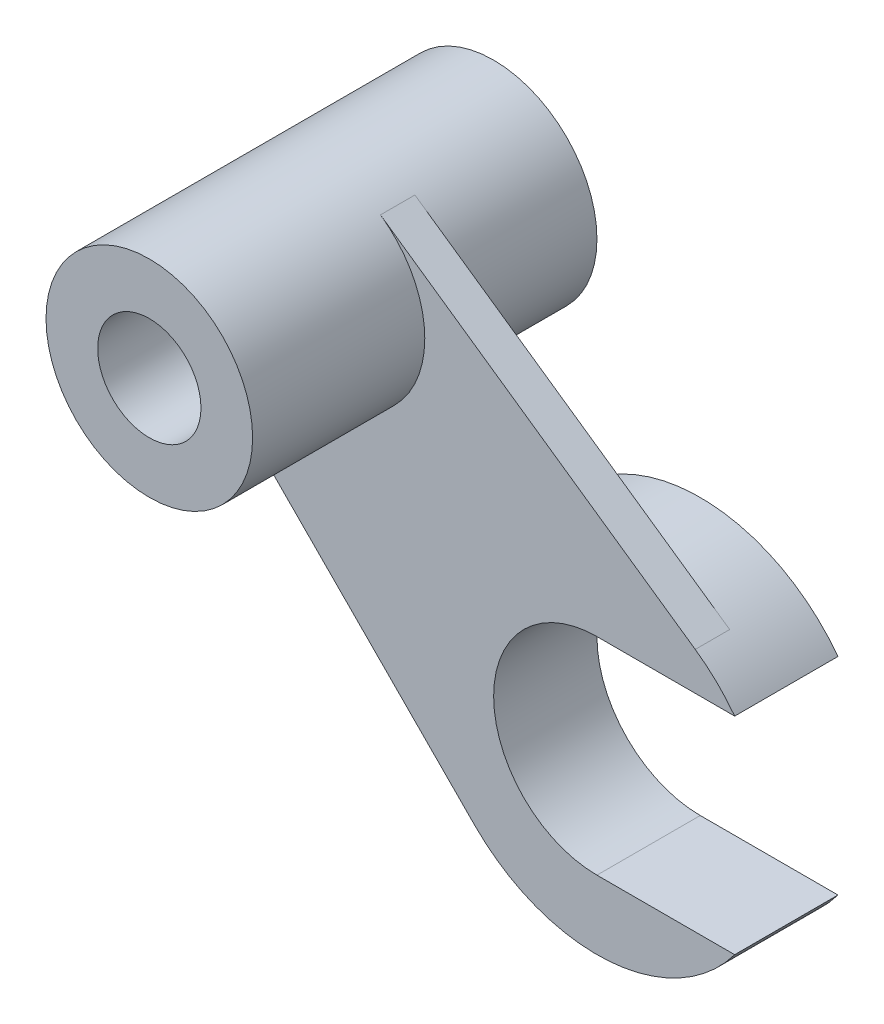
ISO-10303-21;
HEADER;
FILE_DESCRIPTION(('STEP AP214'),'2;1');
FILE_NAME('part.step','',(''),(''),'','','');
FILE_SCHEMA(('AUTOMOTIVE_DESIGN { 1 0 10303 214 1 1 1 1 }'));
ENDSEC;
DATA;
#1=APPLICATION_CONTEXT('core data for automotive mechanical design processes');
#2=APPLICATION_PROTOCOL_DEFINITION('international standard','automotive_design',2000,#1);
#3=PRODUCT_CONTEXT('',#1,'mechanical');
#4=PRODUCT('Part','Part','',(#3));
#5=PRODUCT_RELATED_PRODUCT_CATEGORY('part','',(#4));
#6=PRODUCT_DEFINITION_FORMATION('','',#4);
#7=PRODUCT_DEFINITION_CONTEXT('part definition',#1,'design');
#8=PRODUCT_DEFINITION('design','',#6,#7);
#9=PRODUCT_DEFINITION_SHAPE('','',#8);
#10=(LENGTH_UNIT() NAMED_UNIT(*) SI_UNIT(.MILLI.,.METRE.));
#11=(NAMED_UNIT(*) PLANE_ANGLE_UNIT() SI_UNIT($,.RADIAN.));
#12=(NAMED_UNIT(*) SI_UNIT($,.STERADIAN.) SOLID_ANGLE_UNIT());
#13=UNCERTAINTY_MEASURE_WITH_UNIT(LENGTH_MEASURE(1.E-05),#10,'distance_accuracy_value','');
#14=(GEOMETRIC_REPRESENTATION_CONTEXT(3) GLOBAL_UNCERTAINTY_ASSIGNED_CONTEXT((#13)) GLOBAL_UNIT_ASSIGNED_CONTEXT((#10,
#11,#12)) REPRESENTATION_CONTEXT('',''));
#15=CARTESIAN_POINT('',(0.,0.,0.));
#16=DIRECTION('',(0.,0.,1.));
#17=DIRECTION('',(1.,0.,0.));
#18=AXIS2_PLACEMENT_3D('',#15,#16,#17);
#19=CARTESIAN_POINT('',(0.,0.,50.));
#20=DIRECTION('',(0.,0.,-1.));
#21=DIRECTION('',(-1.,0.,0.));
#22=AXIS2_PLACEMENT_3D('',#19,#20,#21);
#23=CYLINDRICAL_SURFACE('',#22,30.);
#24=CARTESIAN_POINT('',(0.,0.,-50.));
#25=DIRECTION('',(0.,0.,1.));
#26=DIRECTION('',(1.,0.,0.));
#27=AXIS2_PLACEMENT_3D('',#24,#25,#26);
#28=CIRCLE('',#27,30.);
#29=CARTESIAN_POINT('',(30.,0.,-50.));
#30=VERTEX_POINT('',#29);
#31=EDGE_CURVE('E186',#30,#30,#28,.T.);
#32=ORIENTED_EDGE('',*,*,#31,.T.);
#33=EDGE_LOOP('',(#32));
#34=FACE_BOUND('',#33,.T.);
#35=CARTESIAN_POINT('',(0.,0.,50.));
#36=DIRECTION('',(0.,0.,1.));
#37=DIRECTION('',(1.,0.,0.));
#38=AXIS2_PLACEMENT_3D('',#35,#36,#37);
#39=CIRCLE('',#38,30.);
#40=CARTESIAN_POINT('',(30.,0.,50.));
#41=VERTEX_POINT('',#40);
#42=EDGE_CURVE('E205',#41,#41,#39,.T.);
#43=ORIENTED_EDGE('',*,*,#42,.F.);
#44=EDGE_LOOP('',(#43));
#45=FACE_BOUND('',#44,.T.);
#46=CARTESIAN_POINT('',(0.,0.,-9.99999999999999));
#47=DIRECTION('',(0.,0.,1.));
#48=DIRECTION('',(1.,0.,0.));
#49=AXIS2_PLACEMENT_3D('',#46,#47,#48);
#50=CIRCLE('',#49,30.);
#51=CARTESIAN_POINT('',(-30.,0.,-10.));
#52=VERTEX_POINT('',#51);
#53=CARTESIAN_POINT('',(17.1291163606126,24.6291163606126,-10.));
#54=VERTEX_POINT('',#53);
#55=EDGE_CURVE('E121',#52,#54,#50,.T.);
#56=ORIENTED_EDGE('',*,*,#55,.F.);
#57=DIRECTION('',(0.,0.,1.));
#58=VECTOR('',#57,1.);
#59=CARTESIAN_POINT('',(-30.,0.,-10.));
#60=LINE('',#59,#58);
#61=CARTESIAN_POINT('',(-30.,0.,0.));
#62=VERTEX_POINT('',#61);
#63=EDGE_CURVE('E187',#52,#62,#60,.T.);
#64=ORIENTED_EDGE('',*,*,#63,.T.);
#65=CARTESIAN_POINT('',(0.,0.,0.));
#66=DIRECTION('',(0.,0.,1.));
#67=DIRECTION('',(1.,0.,0.));
#68=AXIS2_PLACEMENT_3D('',#65,#66,#67);
#69=CIRCLE('',#68,30.);
#70=CARTESIAN_POINT('',(17.1291163606126,24.6291163606126,0.));
#71=VERTEX_POINT('',#70);
#72=EDGE_CURVE('E209',#62,#71,#69,.T.);
#73=ORIENTED_EDGE('',*,*,#72,.T.);
#74=DIRECTION('',(0.,0.,1.));
#75=VECTOR('',#74,1.);
#76=CARTESIAN_POINT('',(17.1291163606126,24.6291163606126,-10.));
#77=LINE('',#76,#75);
#78=EDGE_CURVE('E191',#54,#71,#77,.T.);
#79=ORIENTED_EDGE('',*,*,#78,.F.);
#80=EDGE_LOOP('',(#56,#64,#73,#79));
#81=FACE_BOUND('',#80,.T.);
#82=ADVANCED_FACE('F45',(#34,#45,#81),#23,.T.);
#83=CARTESIAN_POINT('',(0.,0.,50.));
#84=DIRECTION('',(0.,0.,1.));
#85=DIRECTION('',(1.,0.,0.));
#86=AXIS2_PLACEMENT_3D('',#83,#84,#85);
#87=PLANE('',#86);
#88=CARTESIAN_POINT('',(0.,0.,50.));
#89=DIRECTION('',(0.,0.,1.));
#90=DIRECTION('',(1.,0.,0.));
#91=AXIS2_PLACEMENT_3D('',#88,#89,#90);
#92=CIRCLE('',#91,15.);
#93=CARTESIAN_POINT('',(15.,0.,50.));
#94=VERTEX_POINT('',#93);
#95=EDGE_CURVE('E133',#94,#94,#92,.T.);
#96=ORIENTED_EDGE('',*,*,#95,.F.);
#97=EDGE_LOOP('',(#96));
#98=FACE_BOUND('',#97,.T.);
#99=ORIENTED_EDGE('',*,*,#42,.T.);
#100=EDGE_LOOP('',(#99));
#101=FACE_BOUND('',#100,.T.);
#102=ADVANCED_FACE('F259',(#98,#101),#87,.T.);
#103=CARTESIAN_POINT('',(0.,0.,-50.));
#104=DIRECTION('',(0.,0.,1.));
#105=DIRECTION('',(1.,0.,0.));
#106=AXIS2_PLACEMENT_3D('',#103,#104,#105);
#107=PLANE('',#106);
#108=CARTESIAN_POINT('',(0.,0.,-50.));
#109=DIRECTION('',(0.,0.,1.));
#110=DIRECTION('',(1.,0.,0.));
#111=AXIS2_PLACEMENT_3D('',#108,#109,#110);
#112=CIRCLE('',#111,15.);
#113=CARTESIAN_POINT('',(15.,0.,-50.));
#114=VERTEX_POINT('',#113);
#115=EDGE_CURVE('E139',#114,#114,#112,.T.);
#116=ORIENTED_EDGE('',*,*,#115,.T.);
#117=EDGE_LOOP('',(#116));
#118=FACE_BOUND('',#117,.T.);
#119=ORIENTED_EDGE('',*,*,#31,.F.);
#120=EDGE_LOOP('',(#119));
#121=FACE_BOUND('',#120,.T.);
#122=ADVANCED_FACE('F265',(#118,#121),#107,.F.);
#123=CARTESIAN_POINT('',(-30.,-40.,-10.));
#124=DIRECTION('',(-0.710452707861558,-0.703744946619284,0.));
#125=DIRECTION('',(0.703744946619284,-0.710452707861558,0.));
#126=AXIS2_PLACEMENT_3D('',#123,#124,#125);
#127=PLANE('',#126);
#128=DIRECTION('',(0.703744946619284,-0.710452707861558,0.));
#129=VECTOR('',#128,1.);
#130=CARTESIAN_POINT('',(-30.,-40.,0.));
#131=LINE('',#130,#129);
#132=CARTESIAN_POINT('',(-30.,-40.,0.));
#133=VERTEX_POINT('',#132);
#134=CARTESIAN_POINT('',(44.4773646069221,-115.187247330964,0.));
#135=VERTEX_POINT('',#134);
#136=EDGE_CURVE('E159',#133,#135,#131,.T.);
#137=ORIENTED_EDGE('',*,*,#136,.F.);
#138=DIRECTION('',(0.,0.,1.));
#139=VECTOR('',#138,1.);
#140=CARTESIAN_POINT('',(-30.,-40.,-10.));
#141=LINE('',#140,#139);
#142=CARTESIAN_POINT('',(-30.,-40.,-10.));
#143=VERTEX_POINT('',#142);
#144=EDGE_CURVE('E183',#143,#133,#141,.T.);
#145=ORIENTED_EDGE('',*,*,#144,.F.);
#146=DIRECTION('',(0.703744946619284,-0.710452707861558,0.));
#147=VECTOR('',#146,1.);
#148=CARTESIAN_POINT('',(-30.,-40.,-10.));
#149=LINE('',#148,#147);
#150=CARTESIAN_POINT('',(44.4773646069221,-115.187247330964,-10.));
#151=VERTEX_POINT('',#150);
#152=EDGE_CURVE('E160',#143,#151,#149,.T.);
#153=ORIENTED_EDGE('',*,*,#152,.T.);
#154=DIRECTION('',(0.,0.,1.));
#155=VECTOR('',#154,1.);
#156=CARTESIAN_POINT('',(44.4773646069221,-115.187247330964,-10.));
#157=LINE('',#156,#155);
#158=EDGE_CURVE('E172',#151,#135,#157,.T.);
#159=ORIENTED_EDGE('',*,*,#158,.T.);
#160=EDGE_LOOP('',(#137,#145,#153,#159));
#161=FACE_BOUND('',#160,.T.);
#162=ADVANCED_FACE('F234',(#161),#127,.T.);
#163=CARTESIAN_POINT('',(-30.,-40.,-10.));
#164=DIRECTION('',(1.,0.,0.));
#165=DIRECTION('',(0.,0.,-1.));
#166=AXIS2_PLACEMENT_3D('',#163,#164,#165);
#167=PLANE('',#166);
#168=DIRECTION('',(0.,1.,0.));
#169=VECTOR('',#168,1.);
#170=CARTESIAN_POINT('',(-30.,-40.,0.));
#171=LINE('',#170,#169);
#172=EDGE_CURVE('E165',#133,#62,#171,.T.);
#173=ORIENTED_EDGE('',*,*,#172,.T.);
#174=ORIENTED_EDGE('',*,*,#63,.F.);
#175=DIRECTION('',(0.,1.,0.));
#176=VECTOR('',#175,1.);
#177=CARTESIAN_POINT('',(-30.,-40.,-10.));
#178=LINE('',#177,#176);
#179=EDGE_CURVE('E169',#143,#52,#178,.T.);
#180=ORIENTED_EDGE('',*,*,#179,.F.);
#181=ORIENTED_EDGE('',*,*,#144,.T.);
#182=EDGE_LOOP('',(#173,#174,#180,#181));
#183=FACE_BOUND('',#182,.T.);
#184=ADVANCED_FACE('F232',(#183),#167,.F.);
#185=CARTESIAN_POINT('',(17.1291163606126,24.6291163606126,-10.));
#186=DIRECTION('',(-0.570970545353753,-0.820970545353753,0.));
#187=DIRECTION('',(0.820970545353753,-0.570970545353753,0.));
#188=AXIS2_PLACEMENT_3D('',#185,#186,#187);
#189=PLANE('',#188);
#190=DIRECTION('',(0.820970545353753,-0.570970545353753,0.));
#191=VECTOR('',#190,1.);
#192=CARTESIAN_POINT('',(17.1291163606126,24.6291163606126,0.));
#193=LINE('',#192,#191);
#194=CARTESIAN_POINT('',(108.548527267688,-38.9514727323124,0.));
#195=VERTEX_POINT('',#194);
#196=EDGE_CURVE('E176',#71,#195,#193,.T.);
#197=ORIENTED_EDGE('',*,*,#196,.T.);
#198=DIRECTION('',(0.,0.,1.));
#199=VECTOR('',#198,1.);
#200=CARTESIAN_POINT('',(108.548527267688,-38.9514727323124,-10.));
#201=LINE('',#200,#199);
#202=CARTESIAN_POINT('',(108.548527267688,-38.9514727323124,-9.99999999999999));
#203=VERTEX_POINT('',#202);
#204=EDGE_CURVE('E195',#203,#195,#201,.T.);
#205=ORIENTED_EDGE('',*,*,#204,.F.);
#206=DIRECTION('',(0.820970545353753,-0.570970545353753,0.));
#207=VECTOR('',#206,1.);
#208=CARTESIAN_POINT('',(17.1291163606126,24.6291163606126,-10.));
#209=LINE('',#208,#207);
#210=EDGE_CURVE('E164',#54,#203,#209,.T.);
#211=ORIENTED_EDGE('',*,*,#210,.F.);
#212=ORIENTED_EDGE('',*,*,#78,.T.);
#213=EDGE_LOOP('',(#197,#205,#211,#212));
#214=FACE_BOUND('',#213,.T.);
#215=ADVANCED_FACE('F225',(#214),#189,.F.);
#216=CARTESIAN_POINT('',(0.,0.,-10.));
#217=DIRECTION('',(0.,0.,1.));
#218=DIRECTION('',(1.,0.,0.));
#219=AXIS2_PLACEMENT_3D('',#216,#217,#218);
#220=PLANE('',#219);
#221=ORIENTED_EDGE('',*,*,#210,.T.);
#222=CARTESIAN_POINT('',(80.,-80.,-9.99999999999999));
#223=DIRECTION('',(0.,0.,1.));
#224=DIRECTION('',(1.,0.,0.));
#225=AXIS2_PLACEMENT_3D('',#222,#223,#224);
#226=CIRCLE('',#225,50.);
#227=EDGE_CURVE('E151',#203,#151,#226,.T.);
#228=ORIENTED_EDGE('',*,*,#227,.T.);
#229=ORIENTED_EDGE('',*,*,#152,.F.);
#230=ORIENTED_EDGE('',*,*,#179,.T.);
#231=ORIENTED_EDGE('',*,*,#55,.T.);
#232=EDGE_LOOP('',(#221,#228,#229,#230,#231));
#233=FACE_BOUND('',#232,.T.);
#234=ADVANCED_FACE('F217',(#233),#220,.F.);
#235=CARTESIAN_POINT('',(0.,0.,0.));
#236=DIRECTION('',(0.,0.,1.));
#237=DIRECTION('',(1.,0.,0.));
#238=AXIS2_PLACEMENT_3D('',#235,#236,#237);
#239=PLANE('',#238);
#240=DIRECTION('',(1.,0.,0.));
#241=VECTOR('',#240,1.);
#242=CARTESIAN_POINT('',(0.,-110.,0.));
#243=LINE('',#242,#241);
#244=CARTESIAN_POINT('',(80.,-110.,0.));
#245=VERTEX_POINT('',#244);
#246=CARTESIAN_POINT('',(120.,-110.,0.));
#247=VERTEX_POINT('',#246);
#248=EDGE_CURVE('E141',#245,#247,#243,.T.);
#249=ORIENTED_EDGE('',*,*,#248,.F.);
#250=CARTESIAN_POINT('',(80.,-80.,0.));
#251=DIRECTION('',(0.,0.,1.));
#252=DIRECTION('',(1.,0.,0.));
#253=AXIS2_PLACEMENT_3D('',#250,#251,#252);
#254=CIRCLE('',#253,30.);
#255=CARTESIAN_POINT('',(80.,-50.,0.));
#256=VERTEX_POINT('',#255);
#257=EDGE_CURVE('E134',#256,#245,#254,.T.);
#258=ORIENTED_EDGE('',*,*,#257,.F.);
#259=DIRECTION('',(-1.,0.,0.));
#260=VECTOR('',#259,1.);
#261=CARTESIAN_POINT('',(0.,-50.,0.));
#262=LINE('',#261,#260);
#263=CARTESIAN_POINT('',(120.,-50.,0.));
#264=VERTEX_POINT('',#263);
#265=EDGE_CURVE('E67',#264,#256,#262,.T.);
#266=ORIENTED_EDGE('',*,*,#265,.F.);
#267=CARTESIAN_POINT('',(80.,-80.,0.));
#268=DIRECTION('',(0.,0.,1.));
#269=DIRECTION('',(1.,0.,0.));
#270=AXIS2_PLACEMENT_3D('',#267,#268,#269);
#271=CIRCLE('',#270,50.);
#272=EDGE_CURVE('E148',#264,#195,#271,.T.);
#273=ORIENTED_EDGE('',*,*,#272,.T.);
#274=ORIENTED_EDGE('',*,*,#196,.F.);
#275=ORIENTED_EDGE('',*,*,#72,.F.);
#276=ORIENTED_EDGE('',*,*,#172,.F.);
#277=ORIENTED_EDGE('',*,*,#136,.T.);
#278=EDGE_CURVE('E152',#135,#247,#271,.T.);
#279=ORIENTED_EDGE('',*,*,#278,.T.);
#280=EDGE_LOOP('',(#249,#258,#266,#273,#274,#275,#276,#277,#279));
#281=FACE_BOUND('',#280,.T.);
#282=ADVANCED_FACE('F229',(#281),#239,.T.);
#283=CARTESIAN_POINT('',(80.,-80.,-30.));
#284=DIRECTION('',(0.,0.,1.));
#285=DIRECTION('',(1.,0.,0.));
#286=AXIS2_PLACEMENT_3D('',#283,#284,#285);
#287=CYLINDRICAL_SURFACE('',#286,50.);
#288=DIRECTION('',(0.,0.,1.));
#289=VECTOR('',#288,1.);
#290=CARTESIAN_POINT('',(120.,-110.,-30.));
#291=LINE('',#290,#289);
#292=CARTESIAN_POINT('',(120.,-110.,-30.));
#293=VERTEX_POINT('',#292);
#294=EDGE_CURVE('E238',#247,#293,#291,.F.);
#295=ORIENTED_EDGE('',*,*,#294,.F.);
#296=ORIENTED_EDGE('',*,*,#278,.F.);
#297=ORIENTED_EDGE('',*,*,#158,.F.);
#298=ORIENTED_EDGE('',*,*,#227,.F.);
#299=ORIENTED_EDGE('',*,*,#204,.T.);
#300=ORIENTED_EDGE('',*,*,#272,.F.);
#301=DIRECTION('',(0.,0.,1.));
#302=VECTOR('',#301,1.);
#303=CARTESIAN_POINT('',(120.,-50.,-30.));
#304=LINE('',#303,#302);
#305=CARTESIAN_POINT('',(120.,-50.,-30.));
#306=VERTEX_POINT('',#305);
#307=EDGE_CURVE('E243',#306,#264,#304,.T.);
#308=ORIENTED_EDGE('',*,*,#307,.F.);
#309=CARTESIAN_POINT('',(80.,-80.,-30.));
#310=DIRECTION('',(0.,0.,1.));
#311=DIRECTION('',(1.,0.,0.));
#312=AXIS2_PLACEMENT_3D('',#309,#310,#311);
#313=CIRCLE('',#312,50.);
#314=EDGE_CURVE('E128',#306,#293,#313,.T.);
#315=ORIENTED_EDGE('',*,*,#314,.T.);
#316=EDGE_LOOP('',(#295,#296,#297,#298,#299,#300,#308,#315));
#317=FACE_BOUND('',#316,.T.);
#318=ADVANCED_FACE('F237',(#317),#287,.T.);
#319=CARTESIAN_POINT('',(80.,-80.,-30.));
#320=DIRECTION('',(0.,0.,1.));
#321=DIRECTION('',(1.,0.,0.));
#322=AXIS2_PLACEMENT_3D('',#319,#320,#321);
#323=PLANE('',#322);
#324=CARTESIAN_POINT('',(80.,-80.,-30.));
#325=DIRECTION('',(0.,0.,1.));
#326=DIRECTION('',(1.,0.,0.));
#327=AXIS2_PLACEMENT_3D('',#324,#325,#326);
#328=CIRCLE('',#327,30.);
#329=CARTESIAN_POINT('',(80.,-50.,-30.));
#330=VERTEX_POINT('',#329);
#331=CARTESIAN_POINT('',(80.,-110.,-30.));
#332=VERTEX_POINT('',#331);
#333=EDGE_CURVE('E126',#330,#332,#328,.T.);
#334=ORIENTED_EDGE('',*,*,#333,.T.);
#335=DIRECTION('',(-1.,0.,0.));
#336=VECTOR('',#335,1.);
#337=CARTESIAN_POINT('',(80.,-110.,-30.));
#338=LINE('',#337,#336);
#339=EDGE_CURVE('E60',#293,#332,#338,.T.);
#340=ORIENTED_EDGE('',*,*,#339,.F.);
#341=ORIENTED_EDGE('',*,*,#314,.F.);
#342=DIRECTION('',(1.,0.,0.));
#343=VECTOR('',#342,1.);
#344=CARTESIAN_POINT('',(80.,-50.,-30.));
#345=LINE('',#344,#343);
#346=EDGE_CURVE('E114',#330,#306,#345,.T.);
#347=ORIENTED_EDGE('',*,*,#346,.F.);
#348=EDGE_LOOP('',(#334,#340,#341,#347));
#349=FACE_BOUND('',#348,.T.);
#350=ADVANCED_FACE('F125',(#349),#323,.F.);
#351=CARTESIAN_POINT('',(0.,0.,50.));
#352=DIRECTION('',(0.,0.,1.));
#353=DIRECTION('',(1.,0.,0.));
#354=AXIS2_PLACEMENT_3D('',#351,#352,#353);
#355=CYLINDRICAL_SURFACE('',#354,15.);
#356=ORIENTED_EDGE('',*,*,#115,.F.);
#357=EDGE_LOOP('',(#356));
#358=FACE_BOUND('',#357,.T.);
#359=ORIENTED_EDGE('',*,*,#95,.T.);
#360=EDGE_LOOP('',(#359));
#361=FACE_BOUND('',#360,.T.);
#362=ADVANCED_FACE('F292',(#358,#361),#355,.F.);
#363=CARTESIAN_POINT('',(80.,-80.,0.));
#364=DIRECTION('',(0.,0.,1.));
#365=DIRECTION('',(1.,0.,0.));
#366=AXIS2_PLACEMENT_3D('',#363,#364,#365);
#367=CYLINDRICAL_SURFACE('',#366,30.);
#368=ORIENTED_EDGE('',*,*,#257,.T.);
#369=DIRECTION('',(0.,0.,1.));
#370=VECTOR('',#369,1.);
#371=CARTESIAN_POINT('',(80.,-110.,0.));
#372=LINE('',#371,#370);
#373=EDGE_CURVE('E11',#245,#332,#372,.F.);
#374=ORIENTED_EDGE('',*,*,#373,.T.);
#375=ORIENTED_EDGE('',*,*,#333,.F.);
#376=DIRECTION('',(0.,0.,1.));
#377=VECTOR('',#376,1.);
#378=CARTESIAN_POINT('',(80.,-50.,0.));
#379=LINE('',#378,#377);
#380=EDGE_CURVE('E53',#256,#330,#379,.F.);
#381=ORIENTED_EDGE('',*,*,#380,.F.);
#382=EDGE_LOOP('',(#368,#374,#375,#381));
#383=FACE_BOUND('',#382,.T.);
#384=ADVANCED_FACE('F131',(#383),#367,.F.);
#385=CARTESIAN_POINT('',(80.,-50.,10.));
#386=DIRECTION('',(0.,1.,0.));
#387=DIRECTION('',(0.,0.,1.));
#388=AXIS2_PLACEMENT_3D('',#385,#386,#387);
#389=PLANE('',#388);
#390=ORIENTED_EDGE('',*,*,#265,.T.);
#391=ORIENTED_EDGE('',*,*,#380,.T.);
#392=ORIENTED_EDGE('',*,*,#346,.T.);
#393=ORIENTED_EDGE('',*,*,#307,.T.);
#394=EDGE_LOOP('',(#390,#391,#392,#393));
#395=FACE_BOUND('',#394,.T.);
#396=ADVANCED_FACE('F113',(#395),#389,.F.);
#397=CARTESIAN_POINT('',(80.,-110.,10.));
#398=DIRECTION('',(0.,-1.,0.));
#399=DIRECTION('',(0.,0.,-1.));
#400=AXIS2_PLACEMENT_3D('',#397,#398,#399);
#401=PLANE('',#400);
#402=ORIENTED_EDGE('',*,*,#248,.T.);
#403=ORIENTED_EDGE('',*,*,#294,.T.);
#404=ORIENTED_EDGE('',*,*,#339,.T.);
#405=ORIENTED_EDGE('',*,*,#373,.F.);
#406=EDGE_LOOP('',(#402,#403,#404,#405));
#407=FACE_BOUND('',#406,.T.);
#408=ADVANCED_FACE('F251',(#407),#401,.F.);
#409=CLOSED_SHELL('',(#82,#102,#122,#162,#184,#215,#234,#282,#318,#350,#362,#384,#396,#408));
#410=MANIFOLD_SOLID_BREP('B2',#409);
#411=ADVANCED_BREP_SHAPE_REPRESENTATION('',(#18,#410),#14);
#412=SHAPE_DEFINITION_REPRESENTATION(#9,#411);
ENDSEC;
END-ISO-10303-21;
